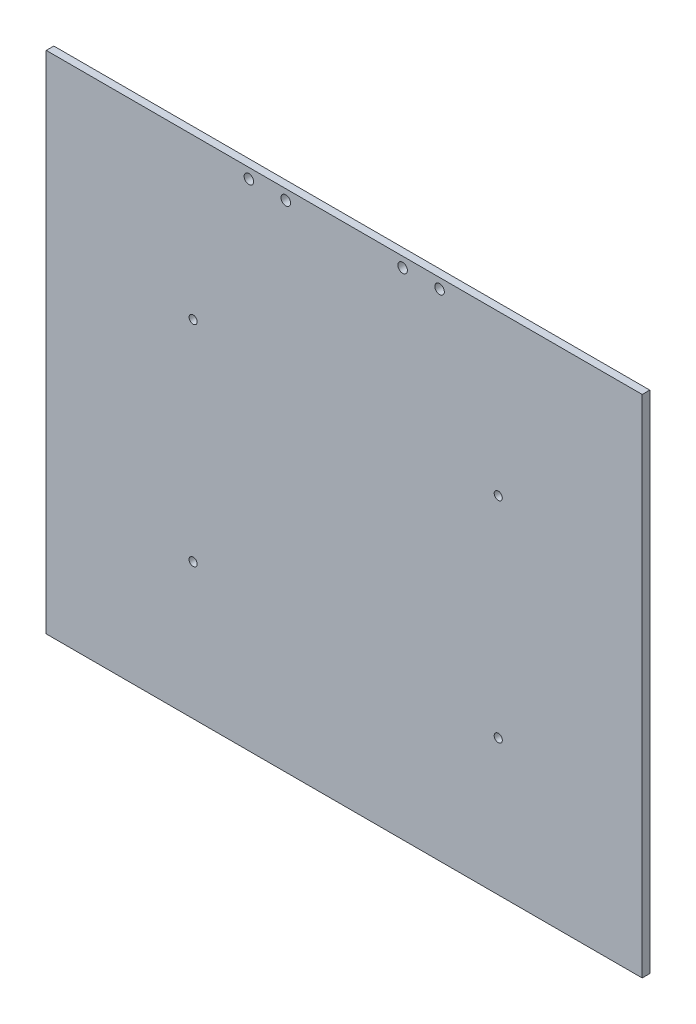
ISO-10303-21;
HEADER;
FILE_DESCRIPTION(('STEP AP214'),'2;1');
FILE_NAME('part.step','',(''),(''),'','','');
FILE_SCHEMA(('AUTOMOTIVE_DESIGN { 1 0 10303 214 1 1 1 1 }'));
ENDSEC;
DATA;
#1=APPLICATION_CONTEXT('core data for automotive mechanical design processes');
#2=APPLICATION_PROTOCOL_DEFINITION('international standard','automotive_design',2000,#1);
#3=PRODUCT_CONTEXT('',#1,'mechanical');
#4=PRODUCT('Part','Part','',(#3));
#5=PRODUCT_RELATED_PRODUCT_CATEGORY('part','',(#4));
#6=PRODUCT_DEFINITION_FORMATION('','',#4);
#7=PRODUCT_DEFINITION_CONTEXT('part definition',#1,'design');
#8=PRODUCT_DEFINITION('design','',#6,#7);
#9=PRODUCT_DEFINITION_SHAPE('','',#8);
#10=(LENGTH_UNIT() NAMED_UNIT(*) SI_UNIT(.MILLI.,.METRE.));
#11=(NAMED_UNIT(*) PLANE_ANGLE_UNIT() SI_UNIT($,.RADIAN.));
#12=(NAMED_UNIT(*) SI_UNIT($,.STERADIAN.) SOLID_ANGLE_UNIT());
#13=UNCERTAINTY_MEASURE_WITH_UNIT(LENGTH_MEASURE(1.E-05),#10,'distance_accuracy_value','');
#14=(GEOMETRIC_REPRESENTATION_CONTEXT(3) GLOBAL_UNCERTAINTY_ASSIGNED_CONTEXT((#13)) GLOBAL_UNIT_ASSIGNED_CONTEXT((#10,
#11,#12)) REPRESENTATION_CONTEXT('',''));
#15=CARTESIAN_POINT('',(0.,0.,0.));
#16=DIRECTION('',(0.,0.,1.));
#17=DIRECTION('',(1.,0.,0.));
#18=AXIS2_PLACEMENT_3D('',#15,#16,#17);
#19=CARTESIAN_POINT('',(0.,0.,3.175));
#20=DIRECTION('',(0.,0.,1.));
#21=DIRECTION('',(1.,0.,0.));
#22=AXIS2_PLACEMENT_3D('',#19,#20,#21);
#23=PLANE('',#22);
#24=CARTESIAN_POINT('',(-119.2175781854,188.051399824973,3.175));
#25=DIRECTION('',(0.,0.,1.));
#26=DIRECTION('',(1.,0.,0.));
#27=AXIS2_PLACEMENT_3D('',#24,#25,#26);
#28=CIRCLE('',#27,1.99999999999998);
#29=CARTESIAN_POINT('',(-117.2175781854,188.051399824973,3.175));
#30=VERTEX_POINT('',#29);
#31=EDGE_CURVE('E145',#30,#30,#28,.T.);
#32=ORIENTED_EDGE('',*,*,#31,.F.);
#33=EDGE_LOOP('',(#32));
#34=FACE_BOUND('',#33,.T.);
#35=CARTESIAN_POINT('',(-54.7175781854004,188.051399824973,3.175));
#36=DIRECTION('',(0.,0.,1.));
#37=DIRECTION('',(1.,0.,0.));
#38=AXIS2_PLACEMENT_3D('',#35,#36,#37);
#39=CIRCLE('',#38,2.);
#40=CARTESIAN_POINT('',(-52.7175781854004,188.051399824973,3.175));
#41=VERTEX_POINT('',#40);
#42=EDGE_CURVE('E133',#41,#41,#39,.T.);
#43=ORIENTED_EDGE('',*,*,#42,.F.);
#44=EDGE_LOOP('',(#43));
#45=FACE_BOUND('',#44,.T.);
#46=CARTESIAN_POINT('',(-158.104348788295,125.310775618319,3.175));
#47=DIRECTION('',(0.,0.,1.));
#48=DIRECTION('',(1.,0.,0.));
#49=AXIS2_PLACEMENT_3D('',#46,#47,#48);
#50=CIRCLE('',#49,1.70000000000001);
#51=CARTESIAN_POINT('',(-156.404348788295,125.310775618319,3.175));
#52=VERTEX_POINT('',#51);
#53=EDGE_CURVE('E121',#52,#52,#50,.T.);
#54=ORIENTED_EDGE('',*,*,#53,.F.);
#55=EDGE_LOOP('',(#54));
#56=FACE_BOUND('',#55,.T.);
#57=CARTESIAN_POINT('',(-158.104348788295,37.3107756183185,3.175));
#58=DIRECTION('',(0.,0.,1.));
#59=DIRECTION('',(1.,0.,0.));
#60=AXIS2_PLACEMENT_3D('',#57,#58,#59);
#61=CIRCLE('',#60,1.69999999999998);
#62=CARTESIAN_POINT('',(-156.404348788295,37.3107756183185,3.175));
#63=VERTEX_POINT('',#62);
#64=EDGE_CURVE('E100',#63,#63,#61,.T.);
#65=ORIENTED_EDGE('',*,*,#64,.F.);
#66=EDGE_LOOP('',(#65));
#67=FACE_BOUND('',#66,.T.);
#68=DIRECTION('',(0.,-1.,0.));
#69=VECTOR('',#68,1.);
#70=CARTESIAN_POINT('',(-219.717578185398,192.282204336251,3.175));
#71=LINE('',#70,#69);
#72=CARTESIAN_POINT('',(-219.717578185398,192.282204336251,3.175));
#73=VERTEX_POINT('',#72);
#74=CARTESIAN_POINT('',(-219.717578185398,-19.7177956637492,3.175));
#75=VERTEX_POINT('',#74);
#76=EDGE_CURVE('E85',#73,#75,#71,.T.);
#77=ORIENTED_EDGE('',*,*,#76,.T.);
#78=DIRECTION('',(1.,0.,0.));
#79=VECTOR('',#78,1.);
#80=CARTESIAN_POINT('',(-219.717578185398,-19.7177956637492,3.175));
#81=LINE('',#80,#79);
#82=CARTESIAN_POINT('',(30.2824218146021,-19.7177956637492,3.175));
#83=VERTEX_POINT('',#82);
#84=EDGE_CURVE('E80',#75,#83,#81,.T.);
#85=ORIENTED_EDGE('',*,*,#84,.T.);
#86=DIRECTION('',(0.,1.,0.));
#87=VECTOR('',#86,1.);
#88=CARTESIAN_POINT('',(30.2824218146021,192.282204336251,3.175));
#89=LINE('',#88,#87);
#90=CARTESIAN_POINT('',(30.2824218146021,192.282204336251,3.175));
#91=VERTEX_POINT('',#90);
#92=EDGE_CURVE('E83',#83,#91,#89,.T.);
#93=ORIENTED_EDGE('',*,*,#92,.T.);
#94=DIRECTION('',(-1.,0.,0.));
#95=VECTOR('',#94,1.);
#96=CARTESIAN_POINT('',(-219.717578185398,192.282204336251,3.175));
#97=LINE('',#96,#95);
#98=EDGE_CURVE('E50',#91,#73,#97,.T.);
#99=ORIENTED_EDGE('',*,*,#98,.T.);
#100=EDGE_LOOP('',(#77,#85,#93,#99));
#101=FACE_BOUND('',#100,.T.);
#102=CARTESIAN_POINT('',(-30.1043487882952,37.3107756183185,3.175));
#103=DIRECTION('',(0.,0.,1.));
#104=DIRECTION('',(1.,0.,0.));
#105=AXIS2_PLACEMENT_3D('',#102,#103,#104);
#106=CIRCLE('',#105,1.69999999999999);
#107=CARTESIAN_POINT('',(-28.4043487882952,37.3107756183185,3.175));
#108=VERTEX_POINT('',#107);
#109=EDGE_CURVE('E115',#108,#108,#106,.T.);
#110=ORIENTED_EDGE('',*,*,#109,.F.);
#111=EDGE_LOOP('',(#110));
#112=FACE_BOUND('',#111,.T.);
#113=CARTESIAN_POINT('',(-30.1043487882951,125.310775618318,3.175));
#114=DIRECTION('',(0.,0.,1.));
#115=DIRECTION('',(1.,0.,0.));
#116=AXIS2_PLACEMENT_3D('',#113,#114,#115);
#117=CIRCLE('',#116,1.70000000000001);
#118=CARTESIAN_POINT('',(-28.4043487882951,125.310775618318,3.175));
#119=VERTEX_POINT('',#118);
#120=EDGE_CURVE('E127',#119,#119,#117,.T.);
#121=ORIENTED_EDGE('',*,*,#120,.F.);
#122=EDGE_LOOP('',(#121));
#123=FACE_BOUND('',#122,.T.);
#124=CARTESIAN_POINT('',(-70.2175781854004,188.051399824973,3.175));
#125=DIRECTION('',(0.,0.,1.));
#126=DIRECTION('',(1.,0.,0.));
#127=AXIS2_PLACEMENT_3D('',#124,#125,#126);
#128=CIRCLE('',#127,2.);
#129=CARTESIAN_POINT('',(-68.2175781854004,188.051399824973,3.175));
#130=VERTEX_POINT('',#129);
#131=EDGE_CURVE('E139',#130,#130,#128,.T.);
#132=ORIENTED_EDGE('',*,*,#131,.F.);
#133=EDGE_LOOP('',(#132));
#134=FACE_BOUND('',#133,.T.);
#135=CARTESIAN_POINT('',(-134.7175781854,188.051399824973,3.175));
#136=DIRECTION('',(0.,0.,1.));
#137=DIRECTION('',(1.,0.,0.));
#138=AXIS2_PLACEMENT_3D('',#135,#136,#137);
#139=CIRCLE('',#138,2.);
#140=CARTESIAN_POINT('',(-132.7175781854,188.051399824973,3.175));
#141=VERTEX_POINT('',#140);
#142=EDGE_CURVE('E151',#141,#141,#139,.T.);
#143=ORIENTED_EDGE('',*,*,#142,.F.);
#144=EDGE_LOOP('',(#143));
#145=FACE_BOUND('',#144,.T.);
#146=ADVANCED_FACE('F33',(#34,#45,#56,#67,#101,#112,#123,#134,#145),#23,.T.);
#147=CARTESIAN_POINT('',(0.,0.,0.));
#148=DIRECTION('',(0.,0.,1.));
#149=DIRECTION('',(1.,0.,0.));
#150=AXIS2_PLACEMENT_3D('',#147,#148,#149);
#151=PLANE('',#150);
#152=DIRECTION('',(0.,-1.,0.));
#153=VECTOR('',#152,1.);
#154=CARTESIAN_POINT('',(-219.717578185398,192.282204336251,0.));
#155=LINE('',#154,#153);
#156=CARTESIAN_POINT('',(-219.717578185398,192.282204336251,0.));
#157=VERTEX_POINT('',#156);
#158=CARTESIAN_POINT('',(-219.717578185398,-19.7177956637492,0.));
#159=VERTEX_POINT('',#158);
#160=EDGE_CURVE('E97',#157,#159,#155,.T.);
#161=ORIENTED_EDGE('',*,*,#160,.F.);
#162=DIRECTION('',(-1.,0.,0.));
#163=VECTOR('',#162,1.);
#164=CARTESIAN_POINT('',(-219.717578185398,192.282204336251,0.));
#165=LINE('',#164,#163);
#166=CARTESIAN_POINT('',(30.2824218146021,192.282204336251,0.));
#167=VERTEX_POINT('',#166);
#168=EDGE_CURVE('E73',#167,#157,#165,.T.);
#169=ORIENTED_EDGE('',*,*,#168,.F.);
#170=DIRECTION('',(0.,1.,0.));
#171=VECTOR('',#170,1.);
#172=CARTESIAN_POINT('',(30.2824218146021,192.282204336251,0.));
#173=LINE('',#172,#171);
#174=CARTESIAN_POINT('',(30.2824218146021,-19.7177956637492,0.));
#175=VERTEX_POINT('',#174);
#176=EDGE_CURVE('E67',#175,#167,#173,.T.);
#177=ORIENTED_EDGE('',*,*,#176,.F.);
#178=DIRECTION('',(1.,0.,0.));
#179=VECTOR('',#178,1.);
#180=CARTESIAN_POINT('',(-219.717578185398,-19.7177956637492,0.));
#181=LINE('',#180,#179);
#182=EDGE_CURVE('E89',#159,#175,#181,.T.);
#183=ORIENTED_EDGE('',*,*,#182,.F.);
#184=EDGE_LOOP('',(#161,#169,#177,#183));
#185=FACE_BOUND('',#184,.T.);
#186=CARTESIAN_POINT('',(-158.104348788295,37.3107756183185,0.));
#187=DIRECTION('',(0.,0.,1.));
#188=DIRECTION('',(1.,0.,0.));
#189=AXIS2_PLACEMENT_3D('',#186,#187,#188);
#190=CIRCLE('',#189,1.69999999999998);
#191=CARTESIAN_POINT('',(-156.404348788295,37.3107756183185,0.));
#192=VERTEX_POINT('',#191);
#193=EDGE_CURVE('E112',#192,#192,#190,.T.);
#194=ORIENTED_EDGE('',*,*,#193,.T.);
#195=EDGE_LOOP('',(#194));
#196=FACE_BOUND('',#195,.T.);
#197=CARTESIAN_POINT('',(-30.1043487882952,37.3107756183185,0.));
#198=DIRECTION('',(0.,0.,1.));
#199=DIRECTION('',(1.,0.,0.));
#200=AXIS2_PLACEMENT_3D('',#197,#198,#199);
#201=CIRCLE('',#200,1.69999999999999);
#202=CARTESIAN_POINT('',(-28.4043487882952,37.3107756183185,0.));
#203=VERTEX_POINT('',#202);
#204=EDGE_CURVE('E118',#203,#203,#201,.T.);
#205=ORIENTED_EDGE('',*,*,#204,.T.);
#206=EDGE_LOOP('',(#205));
#207=FACE_BOUND('',#206,.T.);
#208=CARTESIAN_POINT('',(-158.104348788295,125.310775618319,0.));
#209=DIRECTION('',(0.,0.,1.));
#210=DIRECTION('',(1.,0.,0.));
#211=AXIS2_PLACEMENT_3D('',#208,#209,#210);
#212=CIRCLE('',#211,1.70000000000001);
#213=CARTESIAN_POINT('',(-156.404348788295,125.310775618319,0.));
#214=VERTEX_POINT('',#213);
#215=EDGE_CURVE('E124',#214,#214,#212,.T.);
#216=ORIENTED_EDGE('',*,*,#215,.T.);
#217=EDGE_LOOP('',(#216));
#218=FACE_BOUND('',#217,.T.);
#219=CARTESIAN_POINT('',(-30.1043487882951,125.310775618318,0.));
#220=DIRECTION('',(0.,0.,1.));
#221=DIRECTION('',(1.,0.,0.));
#222=AXIS2_PLACEMENT_3D('',#219,#220,#221);
#223=CIRCLE('',#222,1.70000000000001);
#224=CARTESIAN_POINT('',(-28.4043487882951,125.310775618318,0.));
#225=VERTEX_POINT('',#224);
#226=EDGE_CURVE('E130',#225,#225,#223,.T.);
#227=ORIENTED_EDGE('',*,*,#226,.T.);
#228=EDGE_LOOP('',(#227));
#229=FACE_BOUND('',#228,.T.);
#230=CARTESIAN_POINT('',(-54.7175781854004,188.051399824973,0.));
#231=DIRECTION('',(0.,0.,1.));
#232=DIRECTION('',(1.,0.,0.));
#233=AXIS2_PLACEMENT_3D('',#230,#231,#232);
#234=CIRCLE('',#233,2.);
#235=CARTESIAN_POINT('',(-52.7175781854004,188.051399824973,0.));
#236=VERTEX_POINT('',#235);
#237=EDGE_CURVE('E136',#236,#236,#234,.T.);
#238=ORIENTED_EDGE('',*,*,#237,.T.);
#239=EDGE_LOOP('',(#238));
#240=FACE_BOUND('',#239,.T.);
#241=CARTESIAN_POINT('',(-70.2175781854004,188.051399824973,0.));
#242=DIRECTION('',(0.,0.,1.));
#243=DIRECTION('',(1.,0.,0.));
#244=AXIS2_PLACEMENT_3D('',#241,#242,#243);
#245=CIRCLE('',#244,2.);
#246=CARTESIAN_POINT('',(-68.2175781854004,188.051399824973,0.));
#247=VERTEX_POINT('',#246);
#248=EDGE_CURVE('E142',#247,#247,#245,.T.);
#249=ORIENTED_EDGE('',*,*,#248,.T.);
#250=EDGE_LOOP('',(#249));
#251=FACE_BOUND('',#250,.T.);
#252=CARTESIAN_POINT('',(-119.2175781854,188.051399824973,0.));
#253=DIRECTION('',(0.,0.,1.));
#254=DIRECTION('',(1.,0.,0.));
#255=AXIS2_PLACEMENT_3D('',#252,#253,#254);
#256=CIRCLE('',#255,1.99999999999998);
#257=CARTESIAN_POINT('',(-117.2175781854,188.051399824973,0.));
#258=VERTEX_POINT('',#257);
#259=EDGE_CURVE('E148',#258,#258,#256,.T.);
#260=ORIENTED_EDGE('',*,*,#259,.T.);
#261=EDGE_LOOP('',(#260));
#262=FACE_BOUND('',#261,.T.);
#263=CARTESIAN_POINT('',(-134.7175781854,188.051399824973,0.));
#264=DIRECTION('',(0.,0.,1.));
#265=DIRECTION('',(1.,0.,0.));
#266=AXIS2_PLACEMENT_3D('',#263,#264,#265);
#267=CIRCLE('',#266,2.);
#268=CARTESIAN_POINT('',(-132.7175781854,188.051399824973,0.));
#269=VERTEX_POINT('',#268);
#270=EDGE_CURVE('E154',#269,#269,#267,.T.);
#271=ORIENTED_EDGE('',*,*,#270,.T.);
#272=EDGE_LOOP('',(#271));
#273=FACE_BOUND('',#272,.T.);
#274=ADVANCED_FACE('F108',(#185,#196,#207,#218,#229,#240,#251,#262,#273),#151,.F.);
#275=CARTESIAN_POINT('',(-219.717578185398,192.282204336251,3.175));
#276=DIRECTION('',(1.,0.,0.));
#277=DIRECTION('',(0.,1.,0.));
#278=AXIS2_PLACEMENT_3D('',#275,#276,#277);
#279=PLANE('',#278);
#280=ORIENTED_EDGE('',*,*,#160,.T.);
#281=DIRECTION('',(0.,0.,-1.));
#282=VECTOR('',#281,1.);
#283=CARTESIAN_POINT('',(-219.717578185398,-19.7177956637492,3.175));
#284=LINE('',#283,#282);
#285=EDGE_CURVE('E11',#75,#159,#284,.T.);
#286=ORIENTED_EDGE('',*,*,#285,.F.);
#287=ORIENTED_EDGE('',*,*,#76,.F.);
#288=DIRECTION('',(0.,0.,-1.));
#289=VECTOR('',#288,1.);
#290=CARTESIAN_POINT('',(-219.717578185398,192.282204336251,3.175));
#291=LINE('',#290,#289);
#292=EDGE_CURVE('E93',#73,#157,#291,.T.);
#293=ORIENTED_EDGE('',*,*,#292,.T.);
#294=EDGE_LOOP('',(#280,#286,#287,#293));
#295=FACE_BOUND('',#294,.T.);
#296=ADVANCED_FACE('F35',(#295),#279,.F.);
#297=CARTESIAN_POINT('',(-219.717578185398,-19.7177956637492,3.175));
#298=DIRECTION('',(0.,1.,0.));
#299=DIRECTION('',(0.,0.,1.));
#300=AXIS2_PLACEMENT_3D('',#297,#298,#299);
#301=PLANE('',#300);
#302=ORIENTED_EDGE('',*,*,#182,.T.);
#303=DIRECTION('',(0.,0.,-1.));
#304=VECTOR('',#303,1.);
#305=CARTESIAN_POINT('',(30.2824218146021,-19.7177956637492,3.175));
#306=LINE('',#305,#304);
#307=EDGE_CURVE('E42',#83,#175,#306,.T.);
#308=ORIENTED_EDGE('',*,*,#307,.F.);
#309=ORIENTED_EDGE('',*,*,#84,.F.);
#310=ORIENTED_EDGE('',*,*,#285,.T.);
#311=EDGE_LOOP('',(#302,#308,#309,#310));
#312=FACE_BOUND('',#311,.T.);
#313=ADVANCED_FACE('F88',(#312),#301,.F.);
#314=CARTESIAN_POINT('',(30.2824218146021,192.282204336251,3.175));
#315=DIRECTION('',(-1.,0.,0.));
#316=DIRECTION('',(0.,-1.,0.));
#317=AXIS2_PLACEMENT_3D('',#314,#315,#316);
#318=PLANE('',#317);
#319=ORIENTED_EDGE('',*,*,#176,.T.);
#320=DIRECTION('',(0.,0.,-1.));
#321=VECTOR('',#320,1.);
#322=CARTESIAN_POINT('',(30.2824218146021,192.282204336251,3.175));
#323=LINE('',#322,#321);
#324=EDGE_CURVE('E90',#91,#167,#323,.T.);
#325=ORIENTED_EDGE('',*,*,#324,.F.);
#326=ORIENTED_EDGE('',*,*,#92,.F.);
#327=ORIENTED_EDGE('',*,*,#307,.T.);
#328=EDGE_LOOP('',(#319,#325,#326,#327));
#329=FACE_BOUND('',#328,.T.);
#330=ADVANCED_FACE('F91',(#329),#318,.F.);
#331=CARTESIAN_POINT('',(-219.717578185398,192.282204336251,3.175));
#332=DIRECTION('',(0.,-1.,0.));
#333=DIRECTION('',(0.,0.,-1.));
#334=AXIS2_PLACEMENT_3D('',#331,#332,#333);
#335=PLANE('',#334);
#336=ORIENTED_EDGE('',*,*,#168,.T.);
#337=ORIENTED_EDGE('',*,*,#292,.F.);
#338=ORIENTED_EDGE('',*,*,#98,.F.);
#339=ORIENTED_EDGE('',*,*,#324,.T.);
#340=EDGE_LOOP('',(#336,#337,#338,#339));
#341=FACE_BOUND('',#340,.T.);
#342=ADVANCED_FACE('F105',(#341),#335,.F.);
#343=CARTESIAN_POINT('',(-158.104348788295,37.3107756183185,3.175));
#344=DIRECTION('',(0.,0.,-1.));
#345=DIRECTION('',(-1.,0.,0.));
#346=AXIS2_PLACEMENT_3D('',#343,#344,#345);
#347=CYLINDRICAL_SURFACE('',#346,1.69999999999998);
#348=ORIENTED_EDGE('',*,*,#64,.T.);
#349=EDGE_LOOP('',(#348));
#350=FACE_BOUND('',#349,.T.);
#351=ORIENTED_EDGE('',*,*,#193,.F.);
#352=EDGE_LOOP('',(#351));
#353=FACE_BOUND('',#352,.T.);
#354=ADVANCED_FACE('F173',(#350,#353),#347,.F.);
#355=CARTESIAN_POINT('',(-30.1043487882952,37.3107756183185,3.175));
#356=DIRECTION('',(0.,0.,-1.));
#357=DIRECTION('',(-1.,0.,0.));
#358=AXIS2_PLACEMENT_3D('',#355,#356,#357);
#359=CYLINDRICAL_SURFACE('',#358,1.69999999999999);
#360=ORIENTED_EDGE('',*,*,#109,.T.);
#361=EDGE_LOOP('',(#360));
#362=FACE_BOUND('',#361,.T.);
#363=ORIENTED_EDGE('',*,*,#204,.F.);
#364=EDGE_LOOP('',(#363));
#365=FACE_BOUND('',#364,.T.);
#366=ADVANCED_FACE('F219',(#362,#365),#359,.F.);
#367=CARTESIAN_POINT('',(-158.104348788295,125.310775618319,3.175));
#368=DIRECTION('',(0.,0.,-1.));
#369=DIRECTION('',(-1.,0.,0.));
#370=AXIS2_PLACEMENT_3D('',#367,#368,#369);
#371=CYLINDRICAL_SURFACE('',#370,1.70000000000001);
#372=ORIENTED_EDGE('',*,*,#53,.T.);
#373=EDGE_LOOP('',(#372));
#374=FACE_BOUND('',#373,.T.);
#375=ORIENTED_EDGE('',*,*,#215,.F.);
#376=EDGE_LOOP('',(#375));
#377=FACE_BOUND('',#376,.T.);
#378=ADVANCED_FACE('F227',(#374,#377),#371,.F.);
#379=CARTESIAN_POINT('',(-30.1043487882951,125.310775618318,3.175));
#380=DIRECTION('',(0.,0.,-1.));
#381=DIRECTION('',(-1.,0.,0.));
#382=AXIS2_PLACEMENT_3D('',#379,#380,#381);
#383=CYLINDRICAL_SURFACE('',#382,1.70000000000001);
#384=ORIENTED_EDGE('',*,*,#120,.T.);
#385=EDGE_LOOP('',(#384));
#386=FACE_BOUND('',#385,.T.);
#387=ORIENTED_EDGE('',*,*,#226,.F.);
#388=EDGE_LOOP('',(#387));
#389=FACE_BOUND('',#388,.T.);
#390=ADVANCED_FACE('F235',(#386,#389),#383,.F.);
#391=CARTESIAN_POINT('',(-54.7175781854004,188.051399824973,3.175));
#392=DIRECTION('',(0.,0.,-1.));
#393=DIRECTION('',(-1.,0.,0.));
#394=AXIS2_PLACEMENT_3D('',#391,#392,#393);
#395=CYLINDRICAL_SURFACE('',#394,2.);
#396=ORIENTED_EDGE('',*,*,#42,.T.);
#397=EDGE_LOOP('',(#396));
#398=FACE_BOUND('',#397,.T.);
#399=ORIENTED_EDGE('',*,*,#237,.F.);
#400=EDGE_LOOP('',(#399));
#401=FACE_BOUND('',#400,.T.);
#402=ADVANCED_FACE('F244',(#398,#401),#395,.F.);
#403=CARTESIAN_POINT('',(-70.2175781854004,188.051399824973,3.175));
#404=DIRECTION('',(0.,0.,-1.));
#405=DIRECTION('',(-1.,0.,0.));
#406=AXIS2_PLACEMENT_3D('',#403,#404,#405);
#407=CYLINDRICAL_SURFACE('',#406,2.);
#408=ORIENTED_EDGE('',*,*,#131,.T.);
#409=EDGE_LOOP('',(#408));
#410=FACE_BOUND('',#409,.T.);
#411=ORIENTED_EDGE('',*,*,#248,.F.);
#412=EDGE_LOOP('',(#411));
#413=FACE_BOUND('',#412,.T.);
#414=ADVANCED_FACE('F253',(#410,#413),#407,.F.);
#415=CARTESIAN_POINT('',(-119.2175781854,188.051399824973,3.175));
#416=DIRECTION('',(0.,0.,-1.));
#417=DIRECTION('',(-1.,0.,0.));
#418=AXIS2_PLACEMENT_3D('',#415,#416,#417);
#419=CYLINDRICAL_SURFACE('',#418,1.99999999999998);
#420=ORIENTED_EDGE('',*,*,#31,.T.);
#421=EDGE_LOOP('',(#420));
#422=FACE_BOUND('',#421,.T.);
#423=ORIENTED_EDGE('',*,*,#259,.F.);
#424=EDGE_LOOP('',(#423));
#425=FACE_BOUND('',#424,.T.);
#426=ADVANCED_FACE('F262',(#422,#425),#419,.F.);
#427=CARTESIAN_POINT('',(-134.7175781854,188.051399824973,3.175));
#428=DIRECTION('',(0.,0.,-1.));
#429=DIRECTION('',(-1.,0.,0.));
#430=AXIS2_PLACEMENT_3D('',#427,#428,#429);
#431=CYLINDRICAL_SURFACE('',#430,2.);
#432=ORIENTED_EDGE('',*,*,#142,.T.);
#433=EDGE_LOOP('',(#432));
#434=FACE_BOUND('',#433,.T.);
#435=ORIENTED_EDGE('',*,*,#270,.F.);
#436=EDGE_LOOP('',(#435));
#437=FACE_BOUND('',#436,.T.);
#438=ADVANCED_FACE('F160',(#434,#437),#431,.F.);
#439=CLOSED_SHELL('',(#146,#274,#296,#313,#330,#342,#354,#366,#378,#390,#402,#414,#426,#438));
#440=MANIFOLD_SOLID_BREP('B2',#439);
#441=ADVANCED_BREP_SHAPE_REPRESENTATION('',(#18,#440),#14);
#442=SHAPE_DEFINITION_REPRESENTATION(#9,#441);
ENDSEC;
END-ISO-10303-21;
